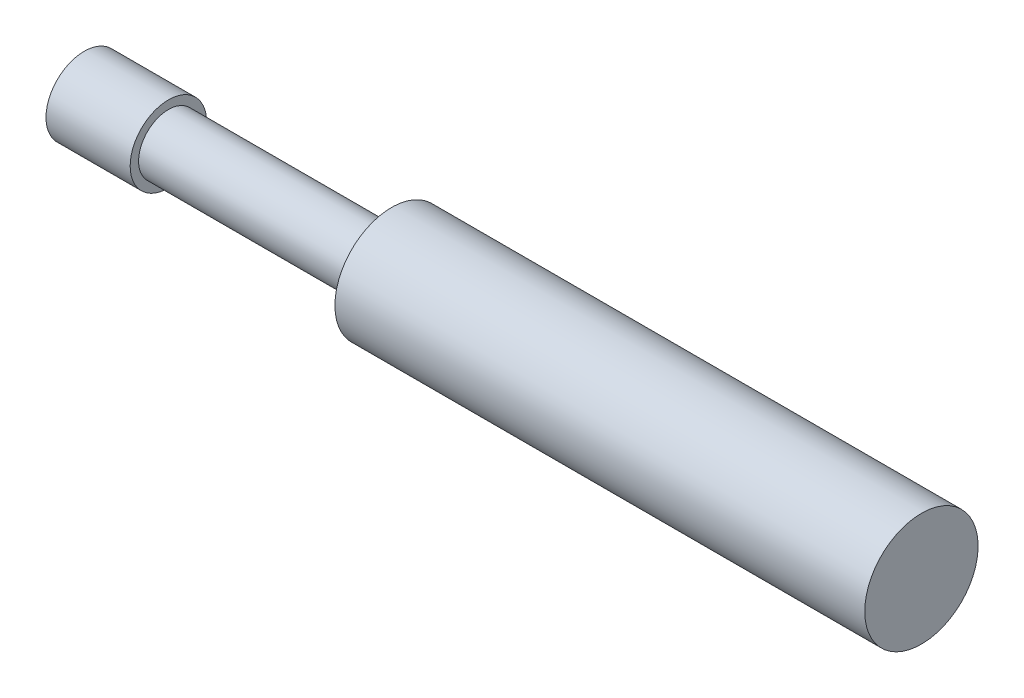
ISO-10303-21;
HEADER;
FILE_DESCRIPTION(('STEP AP214'),'2;1');
FILE_NAME('part.step','',(''),(''),'','','');
FILE_SCHEMA(('AUTOMOTIVE_DESIGN { 1 0 10303 214 1 1 1 1 }'));
ENDSEC;
DATA;
#1=APPLICATION_CONTEXT('core data for automotive mechanical design processes');
#2=APPLICATION_PROTOCOL_DEFINITION('international standard','automotive_design',2000,#1);
#3=PRODUCT_CONTEXT('',#1,'mechanical');
#4=PRODUCT('Part','Part','',(#3));
#5=PRODUCT_RELATED_PRODUCT_CATEGORY('part','',(#4));
#6=PRODUCT_DEFINITION_FORMATION('','',#4);
#7=PRODUCT_DEFINITION_CONTEXT('part definition',#1,'design');
#8=PRODUCT_DEFINITION('design','',#6,#7);
#9=PRODUCT_DEFINITION_SHAPE('','',#8);
#10=(LENGTH_UNIT() NAMED_UNIT(*) SI_UNIT(.MILLI.,.METRE.));
#11=(NAMED_UNIT(*) PLANE_ANGLE_UNIT() SI_UNIT($,.RADIAN.));
#12=(NAMED_UNIT(*) SI_UNIT($,.STERADIAN.) SOLID_ANGLE_UNIT());
#13=UNCERTAINTY_MEASURE_WITH_UNIT(LENGTH_MEASURE(1.E-05),#10,'distance_accuracy_value','');
#14=(GEOMETRIC_REPRESENTATION_CONTEXT(3) GLOBAL_UNCERTAINTY_ASSIGNED_CONTEXT((#13)) GLOBAL_UNIT_ASSIGNED_CONTEXT((#10,
#11,#12)) REPRESENTATION_CONTEXT('',''));
#15=CARTESIAN_POINT('',(0.,0.,0.));
#16=DIRECTION('',(0.,0.,1.));
#17=DIRECTION('',(1.,0.,0.));
#18=AXIS2_PLACEMENT_3D('',#15,#16,#17);
#19=CARTESIAN_POINT('',(193.548,20.701,0.));
#20=DIRECTION('',(-1.,0.,0.));
#21=DIRECTION('',(0.,0.,1.));
#22=AXIS2_PLACEMENT_3D('',#19,#20,#21);
#23=PLANE('',#22);
#24=CARTESIAN_POINT('',(193.548,0.,0.));
#25=DIRECTION('',(-1.,0.,0.));
#26=DIRECTION('',(0.,0.,1.));
#27=AXIS2_PLACEMENT_3D('',#24,#25,#26);
#28=CIRCLE('',#27,20.701);
#29=CARTESIAN_POINT('',(193.548,0.,20.701));
#30=VERTEX_POINT('',#29);
#31=EDGE_CURVE('E56',#30,#30,#28,.T.);
#32=ORIENTED_EDGE('',*,*,#31,.F.);
#33=EDGE_LOOP('',(#32));
#34=FACE_BOUND('',#33,.T.);
#35=ADVANCED_FACE('F34',(#34),#23,.F.);
#36=CARTESIAN_POINT('',(-112.268,0.,0.));
#37=DIRECTION('',(1.,0.,0.));
#38=DIRECTION('',(0.,0.,-1.));
#39=AXIS2_PLACEMENT_3D('',#36,#37,#38);
#40=PLANE('',#39);
#41=CARTESIAN_POINT('',(-112.268,0.,0.));
#42=DIRECTION('',(-1.,0.,0.));
#43=DIRECTION('',(0.,0.,1.));
#44=AXIS2_PLACEMENT_3D('',#41,#42,#43);
#45=CIRCLE('',#44,13.97);
#46=CARTESIAN_POINT('',(-112.268,0.,13.97));
#47=VERTEX_POINT('',#46);
#48=EDGE_CURVE('E10',#47,#47,#45,.T.);
#49=ORIENTED_EDGE('',*,*,#48,.T.);
#50=EDGE_LOOP('',(#49));
#51=FACE_BOUND('',#50,.T.);
#52=ADVANCED_FACE('F63',(#51),#40,.F.);
#53=CARTESIAN_POINT('',(0.,0.,0.));
#54=DIRECTION('',(-1.,0.,0.));
#55=DIRECTION('',(0.,0.,1.));
#56=AXIS2_PLACEMENT_3D('',#53,#54,#55);
#57=CYLINDRICAL_SURFACE('',#56,13.97);
#58=ORIENTED_EDGE('',*,*,#48,.F.);
#59=EDGE_LOOP('',(#58));
#60=FACE_BOUND('',#59,.T.);
#61=CARTESIAN_POINT('',(-81.5237000699811,0.,0.));
#62=DIRECTION('',(-1.,0.,0.));
#63=DIRECTION('',(0.,0.,1.));
#64=AXIS2_PLACEMENT_3D('',#61,#62,#63);
#65=CIRCLE('',#64,13.97);
#66=CARTESIAN_POINT('',(-81.5237000699811,0.,13.97));
#67=VERTEX_POINT('',#66);
#68=EDGE_CURVE('E40',#67,#67,#65,.T.);
#69=ORIENTED_EDGE('',*,*,#68,.T.);
#70=EDGE_LOOP('',(#69));
#71=FACE_BOUND('',#70,.T.);
#72=ADVANCED_FACE('F67',(#60,#71),#57,.T.);
#73=CARTESIAN_POINT('',(-81.5237000699811,13.97,0.));
#74=DIRECTION('',(-1.,0.,0.));
#75=DIRECTION('',(0.,0.,1.));
#76=AXIS2_PLACEMENT_3D('',#73,#74,#75);
#77=PLANE('',#76);
#78=ORIENTED_EDGE('',*,*,#68,.F.);
#79=EDGE_LOOP('',(#78));
#80=FACE_BOUND('',#79,.T.);
#81=CARTESIAN_POINT('',(-81.5237000699811,0.,0.));
#82=DIRECTION('',(-1.,0.,0.));
#83=DIRECTION('',(0.,0.,1.));
#84=AXIS2_PLACEMENT_3D('',#81,#82,#83);
#85=CIRCLE('',#84,10.8955700069981);
#86=CARTESIAN_POINT('',(-81.5237000699811,0.,10.8955700069981));
#87=VERTEX_POINT('',#86);
#88=EDGE_CURVE('E44',#87,#87,#85,.T.);
#89=ORIENTED_EDGE('',*,*,#88,.T.);
#90=EDGE_LOOP('',(#89));
#91=FACE_BOUND('',#90,.T.);
#92=ADVANCED_FACE('F71',(#80,#91),#77,.F.);
#93=CARTESIAN_POINT('',(0.,0.,0.));
#94=DIRECTION('',(-1.,0.,0.));
#95=DIRECTION('',(0.,0.,1.));
#96=AXIS2_PLACEMENT_3D('',#93,#94,#95);
#97=CYLINDRICAL_SURFACE('',#96,10.8955700069981);
#98=ORIENTED_EDGE('',*,*,#88,.F.);
#99=EDGE_LOOP('',(#98));
#100=FACE_BOUND('',#99,.T.);
#101=CARTESIAN_POINT('',(0.,0.,0.));
#102=DIRECTION('',(-1.,0.,0.));
#103=DIRECTION('',(0.,0.,1.));
#104=AXIS2_PLACEMENT_3D('',#101,#102,#103);
#105=CIRCLE('',#104,10.8955700069981);
#106=CARTESIAN_POINT('',(0.,0.,10.8955700069981));
#107=VERTEX_POINT('',#106);
#108=EDGE_CURVE('E48',#107,#107,#105,.T.);
#109=ORIENTED_EDGE('',*,*,#108,.T.);
#110=EDGE_LOOP('',(#109));
#111=FACE_BOUND('',#110,.T.);
#112=ADVANCED_FACE('F77',(#100,#111),#97,.T.);
#113=CARTESIAN_POINT('',(0.,10.8955700069981,0.));
#114=DIRECTION('',(1.,0.,0.));
#115=DIRECTION('',(0.,0.,-1.));
#116=AXIS2_PLACEMENT_3D('',#113,#114,#115);
#117=PLANE('',#116);
#118=ORIENTED_EDGE('',*,*,#108,.F.);
#119=EDGE_LOOP('',(#118));
#120=FACE_BOUND('',#119,.T.);
#121=CARTESIAN_POINT('',(0.,0.,0.));
#122=DIRECTION('',(-1.,0.,0.));
#123=DIRECTION('',(0.,0.,1.));
#124=AXIS2_PLACEMENT_3D('',#121,#122,#123);
#125=CIRCLE('',#124,20.701);
#126=CARTESIAN_POINT('',(0.,0.,20.701));
#127=VERTEX_POINT('',#126);
#128=EDGE_CURVE('E53',#127,#127,#125,.T.);
#129=ORIENTED_EDGE('',*,*,#128,.T.);
#130=EDGE_LOOP('',(#129));
#131=FACE_BOUND('',#130,.T.);
#132=ADVANCED_FACE('F81',(#120,#131),#117,.F.);
#133=CARTESIAN_POINT('',(0.,0.,0.));
#134=DIRECTION('',(-1.,0.,0.));
#135=DIRECTION('',(0.,0.,1.));
#136=AXIS2_PLACEMENT_3D('',#133,#134,#135);
#137=CYLINDRICAL_SURFACE('',#136,20.701);
#138=ORIENTED_EDGE('',*,*,#128,.F.);
#139=EDGE_LOOP('',(#138));
#140=FACE_BOUND('',#139,.T.);
#141=ORIENTED_EDGE('',*,*,#31,.T.);
#142=EDGE_LOOP('',(#141));
#143=FACE_BOUND('',#142,.T.);
#144=ADVANCED_FACE('F60',(#140,#143),#137,.T.);
#145=CLOSED_SHELL('',(#35,#52,#72,#92,#112,#132,#144));
#146=MANIFOLD_SOLID_BREP('B2',#145);
#147=ADVANCED_BREP_SHAPE_REPRESENTATION('',(#18,#146),#14);
#148=SHAPE_DEFINITION_REPRESENTATION(#9,#147);
ENDSEC;
END-ISO-10303-21;
